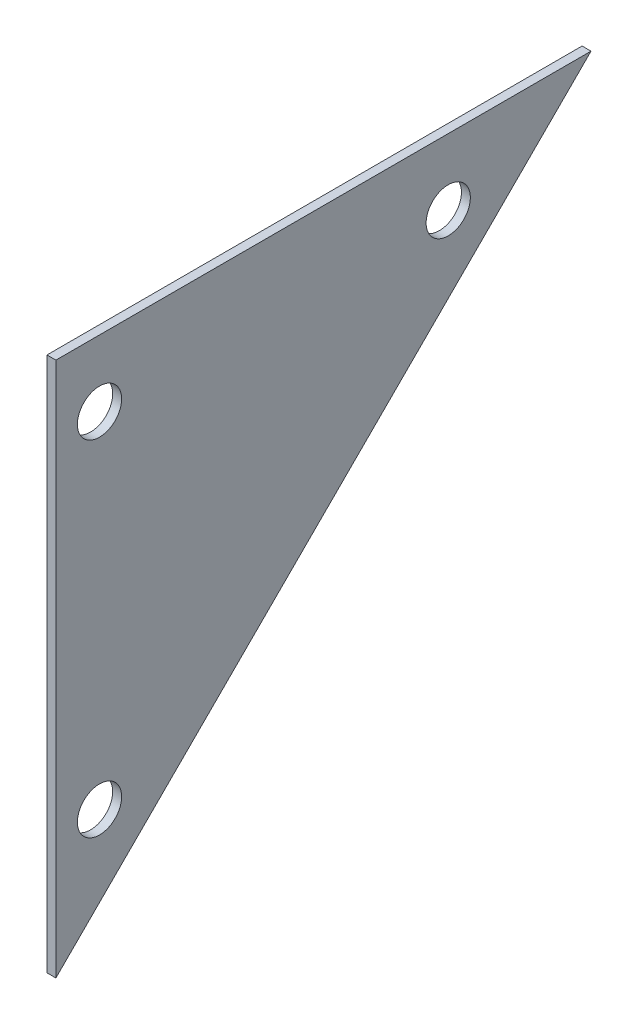
ISO-10303-21;
HEADER;
FILE_DESCRIPTION(('STEP AP214'),'2;1');
FILE_NAME('part.step','',(''),(''),'','','');
FILE_SCHEMA(('AUTOMOTIVE_DESIGN { 1 0 10303 214 1 1 1 1 }'));
ENDSEC;
DATA;
#1=APPLICATION_CONTEXT('core data for automotive mechanical design processes');
#2=APPLICATION_PROTOCOL_DEFINITION('international standard','automotive_design',2000,#1);
#3=PRODUCT_CONTEXT('',#1,'mechanical');
#4=PRODUCT('Part','Part','',(#3));
#5=PRODUCT_RELATED_PRODUCT_CATEGORY('part','',(#4));
#6=PRODUCT_DEFINITION_FORMATION('','',#4);
#7=PRODUCT_DEFINITION_CONTEXT('part definition',#1,'design');
#8=PRODUCT_DEFINITION('design','',#6,#7);
#9=PRODUCT_DEFINITION_SHAPE('','',#8);
#10=(LENGTH_UNIT() NAMED_UNIT(*) SI_UNIT(.MILLI.,.METRE.));
#11=(NAMED_UNIT(*) PLANE_ANGLE_UNIT() SI_UNIT($,.RADIAN.));
#12=(NAMED_UNIT(*) SI_UNIT($,.STERADIAN.) SOLID_ANGLE_UNIT());
#13=UNCERTAINTY_MEASURE_WITH_UNIT(LENGTH_MEASURE(1.E-05),#10,'distance_accuracy_value','');
#14=(GEOMETRIC_REPRESENTATION_CONTEXT(3) GLOBAL_UNCERTAINTY_ASSIGNED_CONTEXT((#13)) GLOBAL_UNIT_ASSIGNED_CONTEXT((#10,
#11,#12)) REPRESENTATION_CONTEXT('',''));
#15=CARTESIAN_POINT('',(0.,0.,0.));
#16=DIRECTION('',(0.,0.,1.));
#17=DIRECTION('',(1.,0.,0.));
#18=AXIS2_PLACEMENT_3D('',#15,#16,#17);
#19=CARTESIAN_POINT('',(0.,0.,0.));
#20=DIRECTION('',(1.,0.,0.));
#21=DIRECTION('',(0.,0.,-1.));
#22=AXIS2_PLACEMENT_3D('',#19,#20,#21);
#23=PLANE('',#22);
#24=CARTESIAN_POINT('',(0.,5.00749715820265,27.0398587245317));
#25=DIRECTION('',(1.,0.,0.));
#26=DIRECTION('',(0.,0.,-1.));
#27=AXIS2_PLACEMENT_3D('',#24,#25,#26);
#28=CIRCLE('',#27,6.3);
#29=CARTESIAN_POINT('',(0.,5.00749715820265,20.7398587245317));
#30=VERTEX_POINT('',#29);
#31=EDGE_CURVE('E165',#30,#30,#28,.T.);
#32=ORIENTED_EDGE('',*,*,#31,.T.);
#33=EDGE_LOOP('',(#32));
#34=FACE_BOUND('',#33,.T.);
#35=CARTESIAN_POINT('',(0.,5.00749715820265,-72.2764829059596));
#36=DIRECTION('',(1.,0.,0.));
#37=DIRECTION('',(0.,0.,-1.));
#38=AXIS2_PLACEMENT_3D('',#35,#36,#37);
#39=CIRCLE('',#38,6.3);
#40=CARTESIAN_POINT('',(0.,5.00749715820265,-78.5764829059596));
#41=VERTEX_POINT('',#40);
#42=EDGE_CURVE('E169',#41,#41,#39,.T.);
#43=ORIENTED_EDGE('',*,*,#42,.T.);
#44=EDGE_LOOP('',(#43));
#45=FACE_BOUND('',#44,.T.);
#46=DIRECTION('',(0.,-1.,0.));
#47=VECTOR('',#46,1.);
#48=CARTESIAN_POINT('',(0.,23.9241590214067,39.4593272171254));
#49=LINE('',#48,#47);
#50=CARTESIAN_POINT('',(0.,23.9241590214067,39.4593272171254));
#51=VERTEX_POINT('',#50);
#52=CARTESIAN_POINT('',(0.,-128.475840978593,39.4593272171254));
#53=VERTEX_POINT('',#52);
#54=EDGE_CURVE('E82',#51,#53,#49,.T.);
#55=ORIENTED_EDGE('',*,*,#54,.F.);
#56=DIRECTION('',(0.,0.,1.));
#57=VECTOR('',#56,1.);
#58=CARTESIAN_POINT('',(0.,23.9241590214067,39.4593272171254));
#59=LINE('',#58,#57);
#60=CARTESIAN_POINT('',(0.,23.9241590214067,-112.940672782875));
#61=VERTEX_POINT('',#60);
#62=EDGE_CURVE('E68',#61,#51,#59,.T.);
#63=ORIENTED_EDGE('',*,*,#62,.F.);
#64=DIRECTION('',(0.,0.707106781186547,-0.707106781186547));
#65=VECTOR('',#64,1.);
#66=CARTESIAN_POINT('',(0.,23.9241590214067,-112.940672782875));
#67=LINE('',#66,#65);
#68=EDGE_CURVE('E63',#53,#61,#67,.T.);
#69=ORIENTED_EDGE('',*,*,#68,.F.);
#70=EDGE_LOOP('',(#55,#63,#69));
#71=FACE_BOUND('',#70,.T.);
#72=CARTESIAN_POINT('',(0.,-93.1122620430057,27.0398587245317));
#73=DIRECTION('',(1.,0.,0.));
#74=DIRECTION('',(0.,0.,-1.));
#75=AXIS2_PLACEMENT_3D('',#72,#73,#74);
#76=CIRCLE('',#75,6.3);
#77=CARTESIAN_POINT('',(0.,-93.1122620430057,20.7398587245317));
#78=VERTEX_POINT('',#77);
#79=EDGE_CURVE('E37',#78,#78,#76,.T.);
#80=ORIENTED_EDGE('',*,*,#79,.T.);
#81=EDGE_LOOP('',(#80));
#82=FACE_BOUND('',#81,.T.);
#83=ADVANCED_FACE('F33',(#34,#45,#71,#82),#23,.F.);
#84=CARTESIAN_POINT('',(2.54,23.9241590214067,39.4593272171254));
#85=DIRECTION('',(0.,0.,-1.));
#86=DIRECTION('',(0.,1.,0.));
#87=AXIS2_PLACEMENT_3D('',#84,#85,#86);
#88=PLANE('',#87);
#89=ORIENTED_EDGE('',*,*,#54,.T.);
#90=DIRECTION('',(-1.,0.,0.));
#91=VECTOR('',#90,1.);
#92=CARTESIAN_POINT('',(2.54,-128.475840978593,39.4593272171254));
#93=LINE('',#92,#91);
#94=CARTESIAN_POINT('',(2.54,-128.475840978593,39.4593272171254));
#95=VERTEX_POINT('',#94);
#96=EDGE_CURVE('E11',#95,#53,#93,.T.);
#97=ORIENTED_EDGE('',*,*,#96,.F.);
#98=DIRECTION('',(0.,-1.,0.));
#99=VECTOR('',#98,1.);
#100=CARTESIAN_POINT('',(2.54,23.9241590214067,39.4593272171254));
#101=LINE('',#100,#99);
#102=CARTESIAN_POINT('',(2.54,23.9241590214067,39.4593272171254));
#103=VERTEX_POINT('',#102);
#104=EDGE_CURVE('E75',#103,#95,#101,.T.);
#105=ORIENTED_EDGE('',*,*,#104,.F.);
#106=DIRECTION('',(-1.,0.,0.));
#107=VECTOR('',#106,1.);
#108=CARTESIAN_POINT('',(2.54,23.9241590214067,39.4593272171254));
#109=LINE('',#108,#107);
#110=EDGE_CURVE('E83',#103,#51,#109,.T.);
#111=ORIENTED_EDGE('',*,*,#110,.T.);
#112=EDGE_LOOP('',(#89,#97,#105,#111));
#113=FACE_BOUND('',#112,.T.);
#114=ADVANCED_FACE('F35',(#113),#88,.F.);
#115=CARTESIAN_POINT('',(2.54,23.9241590214067,-112.940672782875));
#116=DIRECTION('',(0.,0.707106781186548,0.707106781186548));
#117=DIRECTION('',(0.,-0.707106781186548,0.707106781186548));
#118=AXIS2_PLACEMENT_3D('',#115,#116,#117);
#119=PLANE('',#118);
#120=ORIENTED_EDGE('',*,*,#68,.T.);
#121=DIRECTION('',(-1.,0.,0.));
#122=VECTOR('',#121,1.);
#123=CARTESIAN_POINT('',(2.54,23.9241590214067,-112.940672782875));
#124=LINE('',#123,#122);
#125=CARTESIAN_POINT('',(2.54,23.9241590214067,-112.940672782875));
#126=VERTEX_POINT('',#125);
#127=EDGE_CURVE('E43',#126,#61,#124,.T.);
#128=ORIENTED_EDGE('',*,*,#127,.F.);
#129=DIRECTION('',(0.,0.707106781186547,-0.707106781186547));
#130=VECTOR('',#129,1.);
#131=CARTESIAN_POINT('',(2.54,23.9241590214067,-112.940672782875));
#132=LINE('',#131,#130);
#133=EDGE_CURVE('E71',#95,#126,#132,.T.);
#134=ORIENTED_EDGE('',*,*,#133,.F.);
#135=ORIENTED_EDGE('',*,*,#96,.T.);
#136=EDGE_LOOP('',(#120,#128,#134,#135));
#137=FACE_BOUND('',#136,.T.);
#138=ADVANCED_FACE('F72',(#137),#119,.F.);
#139=CARTESIAN_POINT('',(2.54,23.9241590214067,39.4593272171254));
#140=DIRECTION('',(0.,-1.,0.));
#141=DIRECTION('',(0.,0.,-1.));
#142=AXIS2_PLACEMENT_3D('',#139,#140,#141);
#143=PLANE('',#142);
#144=ORIENTED_EDGE('',*,*,#62,.T.);
#145=ORIENTED_EDGE('',*,*,#110,.F.);
#146=DIRECTION('',(0.,0.,1.));
#147=VECTOR('',#146,1.);
#148=CARTESIAN_POINT('',(2.54,23.9241590214067,39.4593272171254));
#149=LINE('',#148,#147);
#150=EDGE_CURVE('E51',#126,#103,#149,.T.);
#151=ORIENTED_EDGE('',*,*,#150,.F.);
#152=ORIENTED_EDGE('',*,*,#127,.T.);
#153=EDGE_LOOP('',(#144,#145,#151,#152));
#154=FACE_BOUND('',#153,.T.);
#155=ADVANCED_FACE('F93',(#154),#143,.F.);
#156=CARTESIAN_POINT('',(2.54,0.,0.));
#157=DIRECTION('',(1.,0.,0.));
#158=DIRECTION('',(0.,0.,-1.));
#159=AXIS2_PLACEMENT_3D('',#156,#157,#158);
#160=PLANE('',#159);
#161=CARTESIAN_POINT('',(2.54,5.00749715820265,27.0398587245317));
#162=DIRECTION('',(1.,0.,0.));
#163=DIRECTION('',(0.,0.,-1.));
#164=AXIS2_PLACEMENT_3D('',#161,#162,#163);
#165=CIRCLE('',#164,6.3);
#166=CARTESIAN_POINT('',(2.54,5.00749715820265,20.7398587245317));
#167=VERTEX_POINT('',#166);
#168=EDGE_CURVE('E162',#167,#167,#165,.T.);
#169=ORIENTED_EDGE('',*,*,#168,.F.);
#170=EDGE_LOOP('',(#169));
#171=FACE_BOUND('',#170,.T.);
#172=CARTESIAN_POINT('',(2.54,5.00749715820265,-72.2764829059596));
#173=DIRECTION('',(1.,0.,0.));
#174=DIRECTION('',(0.,0.,-1.));
#175=AXIS2_PLACEMENT_3D('',#172,#173,#174);
#176=CIRCLE('',#175,6.3);
#177=CARTESIAN_POINT('',(2.54,5.00749715820265,-78.5764829059596));
#178=VERTEX_POINT('',#177);
#179=EDGE_CURVE('E166',#178,#178,#176,.T.);
#180=ORIENTED_EDGE('',*,*,#179,.F.);
#181=EDGE_LOOP('',(#180));
#182=FACE_BOUND('',#181,.T.);
#183=CARTESIAN_POINT('',(2.54,-93.1122620430057,27.0398587245317));
#184=DIRECTION('',(1.,0.,0.));
#185=DIRECTION('',(0.,0.,-1.));
#186=AXIS2_PLACEMENT_3D('',#183,#184,#185);
#187=CIRCLE('',#186,6.3);
#188=CARTESIAN_POINT('',(2.54,-93.1122620430057,20.7398587245317));
#189=VERTEX_POINT('',#188);
#190=EDGE_CURVE('E88',#189,#189,#187,.T.);
#191=ORIENTED_EDGE('',*,*,#190,.F.);
#192=EDGE_LOOP('',(#191));
#193=FACE_BOUND('',#192,.T.);
#194=ORIENTED_EDGE('',*,*,#104,.T.);
#195=ORIENTED_EDGE('',*,*,#133,.T.);
#196=ORIENTED_EDGE('',*,*,#150,.T.);
#197=EDGE_LOOP('',(#194,#195,#196));
#198=FACE_BOUND('',#197,.T.);
#199=ADVANCED_FACE('F78',(#171,#182,#193,#198),#160,.T.);
#200=CARTESIAN_POINT('',(2.54,-93.1122620430057,27.0398587245317));
#201=DIRECTION('',(1.,0.,0.));
#202=DIRECTION('',(0.,0.,-1.));
#203=AXIS2_PLACEMENT_3D('',#200,#201,#202);
#204=CYLINDRICAL_SURFACE('',#203,6.3);
#205=ORIENTED_EDGE('',*,*,#190,.T.);
#206=EDGE_LOOP('',(#205));
#207=FACE_BOUND('',#206,.T.);
#208=ORIENTED_EDGE('',*,*,#79,.F.);
#209=EDGE_LOOP('',(#208));
#210=FACE_BOUND('',#209,.T.);
#211=ADVANCED_FACE('F100',(#207,#210),#204,.F.);
#212=CARTESIAN_POINT('',(2.54,5.00749715820265,-72.2764829059596));
#213=DIRECTION('',(1.,0.,0.));
#214=DIRECTION('',(0.,0.,-1.));
#215=AXIS2_PLACEMENT_3D('',#212,#213,#214);
#216=CYLINDRICAL_SURFACE('',#215,6.3);
#217=ORIENTED_EDGE('',*,*,#179,.T.);
#218=EDGE_LOOP('',(#217));
#219=FACE_BOUND('',#218,.T.);
#220=ORIENTED_EDGE('',*,*,#42,.F.);
#221=EDGE_LOOP('',(#220));
#222=FACE_BOUND('',#221,.T.);
#223=ADVANCED_FACE('F102',(#219,#222),#216,.F.);
#224=CARTESIAN_POINT('',(2.54,5.00749715820265,27.0398587245317));
#225=DIRECTION('',(1.,0.,0.));
#226=DIRECTION('',(0.,0.,-1.));
#227=AXIS2_PLACEMENT_3D('',#224,#225,#226);
#228=CYLINDRICAL_SURFACE('',#227,6.3);
#229=ORIENTED_EDGE('',*,*,#168,.T.);
#230=EDGE_LOOP('',(#229));
#231=FACE_BOUND('',#230,.T.);
#232=ORIENTED_EDGE('',*,*,#31,.F.);
#233=EDGE_LOOP('',(#232));
#234=FACE_BOUND('',#233,.T.);
#235=ADVANCED_FACE('F109',(#231,#234),#228,.F.);
#236=CLOSED_SHELL('',(#83,#114,#138,#155,#199,#211,#223,#235));
#237=MANIFOLD_SOLID_BREP('B2',#236);
#238=ADVANCED_BREP_SHAPE_REPRESENTATION('',(#18,#237),#14);
#239=SHAPE_DEFINITION_REPRESENTATION(#9,#238);
ENDSEC;
END-ISO-10303-21;
